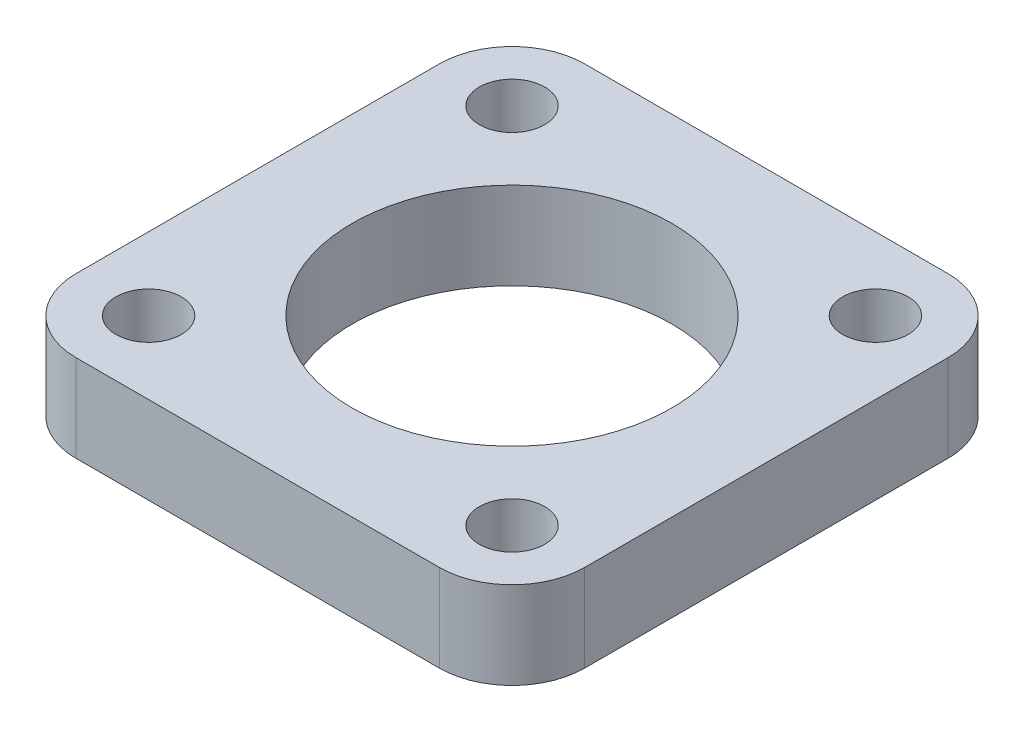
ISO-10303-21;
HEADER;
FILE_DESCRIPTION(('STEP AP214'),'2;1');
FILE_NAME('part.step','',(''),(''),'','','');
FILE_SCHEMA(('AUTOMOTIVE_DESIGN { 1 0 10303 214 1 1 1 1 }'));
ENDSEC;
DATA;
#1=APPLICATION_CONTEXT('core data for automotive mechanical design processes');
#2=APPLICATION_PROTOCOL_DEFINITION('international standard','automotive_design',2000,#1);
#3=PRODUCT_CONTEXT('',#1,'mechanical');
#4=PRODUCT('Part','Part','',(#3));
#5=PRODUCT_RELATED_PRODUCT_CATEGORY('part','',(#4));
#6=PRODUCT_DEFINITION_FORMATION('','',#4);
#7=PRODUCT_DEFINITION_CONTEXT('part definition',#1,'design');
#8=PRODUCT_DEFINITION('design','',#6,#7);
#9=PRODUCT_DEFINITION_SHAPE('','',#8);
#10=(LENGTH_UNIT() NAMED_UNIT(*) SI_UNIT(.MILLI.,.METRE.));
#11=(NAMED_UNIT(*) PLANE_ANGLE_UNIT() SI_UNIT($,.RADIAN.));
#12=(NAMED_UNIT(*) SI_UNIT($,.STERADIAN.) SOLID_ANGLE_UNIT());
#13=UNCERTAINTY_MEASURE_WITH_UNIT(LENGTH_MEASURE(1.E-05),#10,'distance_accuracy_value','');
#14=(GEOMETRIC_REPRESENTATION_CONTEXT(3) GLOBAL_UNCERTAINTY_ASSIGNED_CONTEXT((#13)) GLOBAL_UNIT_ASSIGNED_CONTEXT((#10,
#11,#12)) REPRESENTATION_CONTEXT('',''));
#15=CARTESIAN_POINT('',(0.,0.,0.));
#16=DIRECTION('',(0.,0.,1.));
#17=DIRECTION('',(1.,0.,0.));
#18=AXIS2_PLACEMENT_3D('',#15,#16,#17);
#19=CARTESIAN_POINT('',(0.,3.,0.));
#20=DIRECTION('',(0.,-1.,0.));
#21=DIRECTION('',(0.,0.,-1.));
#22=AXIS2_PLACEMENT_3D('',#19,#20,#21);
#23=PLANE('',#22);
#24=CARTESIAN_POINT('',(12.5000000000044,3.,-12.4999999999972));
#25=DIRECTION('',(0.,1.,0.));
#26=DIRECTION('',(0.,0.,1.));
#27=AXIS2_PLACEMENT_3D('',#24,#25,#26);
#28=CIRCLE('',#27,2.25);
#29=CARTESIAN_POINT('',(12.5000000000044,3.,-10.2499999999972));
#30=VERTEX_POINT('',#29);
#31=EDGE_CURVE('E208',#30,#30,#28,.T.);
#32=ORIENTED_EDGE('',*,*,#31,.F.);
#33=EDGE_LOOP('',(#32));
#34=FACE_BOUND('',#33,.T.);
#35=CARTESIAN_POINT('',(-12.4999999999956,3.,-12.4999999999972));
#36=DIRECTION('',(0.,1.,0.));
#37=DIRECTION('',(0.,0.,1.));
#38=AXIS2_PLACEMENT_3D('',#35,#36,#37);
#39=CIRCLE('',#38,2.25);
#40=CARTESIAN_POINT('',(-12.4999999999956,3.,-10.2499999999972));
#41=VERTEX_POINT('',#40);
#42=EDGE_CURVE('E202',#41,#41,#39,.T.);
#43=ORIENTED_EDGE('',*,*,#42,.F.);
#44=EDGE_LOOP('',(#43));
#45=FACE_BOUND('',#44,.T.);
#46=CARTESIAN_POINT('',(12.5000000000044,3.,12.5000000000028));
#47=DIRECTION('',(0.,1.,0.));
#48=DIRECTION('',(0.,0.,1.));
#49=AXIS2_PLACEMENT_3D('',#46,#47,#48);
#50=CIRCLE('',#49,2.25);
#51=CARTESIAN_POINT('',(12.5000000000044,3.,14.7500000000028));
#52=VERTEX_POINT('',#51);
#53=EDGE_CURVE('E190',#52,#52,#50,.T.);
#54=ORIENTED_EDGE('',*,*,#53,.F.);
#55=EDGE_LOOP('',(#54));
#56=FACE_BOUND('',#55,.T.);
#57=DIRECTION('',(0.,0.,-1.));
#58=VECTOR('',#57,1.);
#59=CARTESIAN_POINT('',(17.5,3.,17.5));
#60=LINE('',#59,#58);
#61=CARTESIAN_POINT('',(17.5,3.,12.5));
#62=VERTEX_POINT('',#61);
#63=CARTESIAN_POINT('',(17.5,3.,-12.5));
#64=VERTEX_POINT('',#63);
#65=EDGE_CURVE('E139',#62,#64,#60,.T.);
#66=ORIENTED_EDGE('',*,*,#65,.T.);
#67=CARTESIAN_POINT('',(12.5,3.,-12.5));
#68=DIRECTION('',(0.,-1.,0.));
#69=DIRECTION('',(0.,0.,-1.));
#70=AXIS2_PLACEMENT_3D('',#67,#68,#69);
#71=CIRCLE('',#70,5.);
#72=CARTESIAN_POINT('',(12.5,3.,-17.5));
#73=VERTEX_POINT('',#72);
#74=EDGE_CURVE('E153',#64,#73,#71,.F.);
#75=ORIENTED_EDGE('',*,*,#74,.T.);
#76=DIRECTION('',(-1.,0.,0.));
#77=VECTOR('',#76,1.);
#78=CARTESIAN_POINT('',(-17.5,3.,-17.5));
#79=LINE('',#78,#77);
#80=CARTESIAN_POINT('',(-12.5,3.,-17.5));
#81=VERTEX_POINT('',#80);
#82=EDGE_CURVE('E120',#73,#81,#79,.T.);
#83=ORIENTED_EDGE('',*,*,#82,.T.);
#84=CARTESIAN_POINT('',(-12.5,3.,-12.5));
#85=DIRECTION('',(0.,-1.,0.));
#86=DIRECTION('',(0.,0.,-1.));
#87=AXIS2_PLACEMENT_3D('',#84,#85,#86);
#88=CIRCLE('',#87,5.);
#89=CARTESIAN_POINT('',(-17.5,3.,-12.5));
#90=VERTEX_POINT('',#89);
#91=EDGE_CURVE('E149',#81,#90,#88,.F.);
#92=ORIENTED_EDGE('',*,*,#91,.T.);
#93=DIRECTION('',(0.,0.,1.));
#94=VECTOR('',#93,1.);
#95=CARTESIAN_POINT('',(-17.5,3.,17.5));
#96=LINE('',#95,#94);
#97=CARTESIAN_POINT('',(-17.5,3.,12.5));
#98=VERTEX_POINT('',#97);
#99=EDGE_CURVE('E162',#90,#98,#96,.T.);
#100=ORIENTED_EDGE('',*,*,#99,.T.);
#101=CARTESIAN_POINT('',(-12.5,3.,12.5));
#102=DIRECTION('',(0.,-1.,0.));
#103=DIRECTION('',(0.,0.,-1.));
#104=AXIS2_PLACEMENT_3D('',#101,#102,#103);
#105=CIRCLE('',#104,5.);
#106=CARTESIAN_POINT('',(-12.5,3.,17.5));
#107=VERTEX_POINT('',#106);
#108=EDGE_CURVE('E55',#98,#107,#105,.F.);
#109=ORIENTED_EDGE('',*,*,#108,.T.);
#110=DIRECTION('',(1.,0.,0.));
#111=VECTOR('',#110,1.);
#112=CARTESIAN_POINT('',(-17.5,3.,17.5));
#113=LINE('',#112,#111);
#114=CARTESIAN_POINT('',(12.5,3.,17.5));
#115=VERTEX_POINT('',#114);
#116=EDGE_CURVE('E140',#107,#115,#113,.T.);
#117=ORIENTED_EDGE('',*,*,#116,.T.);
#118=CARTESIAN_POINT('',(12.5,3.,12.5));
#119=DIRECTION('',(0.,-1.,0.));
#120=DIRECTION('',(0.,0.,-1.));
#121=AXIS2_PLACEMENT_3D('',#118,#119,#120);
#122=CIRCLE('',#121,5.);
#123=EDGE_CURVE('E151',#115,#62,#122,.F.);
#124=ORIENTED_EDGE('',*,*,#123,.T.);
#125=EDGE_LOOP('',(#66,#75,#83,#92,#100,#109,#117,#124));
#126=FACE_BOUND('',#125,.T.);
#127=CARTESIAN_POINT('',(0.,3.,0.));
#128=DIRECTION('',(0.,1.,0.));
#129=DIRECTION('',(0.,0.,1.));
#130=AXIS2_PLACEMENT_3D('',#127,#128,#129);
#131=CIRCLE('',#130,11.);
#132=CARTESIAN_POINT('',(0.,3.,11.));
#133=VERTEX_POINT('',#132);
#134=EDGE_CURVE('E134',#133,#133,#131,.T.);
#135=ORIENTED_EDGE('',*,*,#134,.F.);
#136=EDGE_LOOP('',(#135));
#137=FACE_BOUND('',#136,.T.);
#138=CARTESIAN_POINT('',(-12.4999999999956,3.,12.5000000000029));
#139=DIRECTION('',(0.,1.,0.));
#140=DIRECTION('',(0.,0.,1.));
#141=AXIS2_PLACEMENT_3D('',#138,#139,#140);
#142=CIRCLE('',#141,2.25);
#143=CARTESIAN_POINT('',(-12.4999999999956,3.,14.7500000000029));
#144=VERTEX_POINT('',#143);
#145=EDGE_CURVE('E196',#144,#144,#142,.T.);
#146=ORIENTED_EDGE('',*,*,#145,.F.);
#147=EDGE_LOOP('',(#146));
#148=FACE_BOUND('',#147,.T.);
#149=ADVANCED_FACE('F33',(#34,#45,#56,#126,#137,#148),#23,.F.);
#150=CARTESIAN_POINT('',(0.,-3.,0.));
#151=DIRECTION('',(0.,-1.,0.));
#152=DIRECTION('',(0.,0.,-1.));
#153=AXIS2_PLACEMENT_3D('',#150,#151,#152);
#154=PLANE('',#153);
#155=CARTESIAN_POINT('',(12.5000000000044,-3.,-12.4999999999972));
#156=DIRECTION('',(0.,-1.,0.));
#157=DIRECTION('',(0.,0.,-1.));
#158=AXIS2_PLACEMENT_3D('',#155,#156,#157);
#159=CIRCLE('',#158,2.25);
#160=CARTESIAN_POINT('',(12.5000000000044,-3.,-14.7499999999972));
#161=VERTEX_POINT('',#160);
#162=EDGE_CURVE('E205',#161,#161,#159,.T.);
#163=ORIENTED_EDGE('',*,*,#162,.F.);
#164=EDGE_LOOP('',(#163));
#165=FACE_BOUND('',#164,.T.);
#166=CARTESIAN_POINT('',(-12.4999999999956,-3.,-12.4999999999972));
#167=DIRECTION('',(0.,-1.,0.));
#168=DIRECTION('',(0.,0.,-1.));
#169=AXIS2_PLACEMENT_3D('',#166,#167,#168);
#170=CIRCLE('',#169,2.25);
#171=CARTESIAN_POINT('',(-12.4999999999956,-3.,-14.7499999999972));
#172=VERTEX_POINT('',#171);
#173=EDGE_CURVE('E199',#172,#172,#170,.T.);
#174=ORIENTED_EDGE('',*,*,#173,.F.);
#175=EDGE_LOOP('',(#174));
#176=FACE_BOUND('',#175,.T.);
#177=CARTESIAN_POINT('',(-12.4999999999956,-3.,12.5000000000029));
#178=DIRECTION('',(0.,-1.,0.));
#179=DIRECTION('',(0.,0.,-1.));
#180=AXIS2_PLACEMENT_3D('',#177,#178,#179);
#181=CIRCLE('',#180,2.25);
#182=CARTESIAN_POINT('',(-12.4999999999956,-3.,10.2500000000029));
#183=VERTEX_POINT('',#182);
#184=EDGE_CURVE('E193',#183,#183,#181,.T.);
#185=ORIENTED_EDGE('',*,*,#184,.F.);
#186=EDGE_LOOP('',(#185));
#187=FACE_BOUND('',#186,.T.);
#188=CARTESIAN_POINT('',(12.5000000000044,-3.,12.5000000000028));
#189=DIRECTION('',(0.,-1.,0.));
#190=DIRECTION('',(0.,0.,-1.));
#191=AXIS2_PLACEMENT_3D('',#188,#189,#190);
#192=CIRCLE('',#191,2.25);
#193=CARTESIAN_POINT('',(12.5000000000044,-3.,10.2500000000028));
#194=VERTEX_POINT('',#193);
#195=EDGE_CURVE('E185',#194,#194,#192,.T.);
#196=ORIENTED_EDGE('',*,*,#195,.F.);
#197=EDGE_LOOP('',(#196));
#198=FACE_BOUND('',#197,.T.);
#199=DIRECTION('',(-1.,0.,0.));
#200=VECTOR('',#199,1.);
#201=CARTESIAN_POINT('',(-17.5,-3.,-17.5));
#202=LINE('',#201,#200);
#203=CARTESIAN_POINT('',(12.5,-3.,-17.5));
#204=VERTEX_POINT('',#203);
#205=CARTESIAN_POINT('',(-12.5,-3.,-17.5));
#206=VERTEX_POINT('',#205);
#207=EDGE_CURVE('E117',#204,#206,#202,.T.);
#208=ORIENTED_EDGE('',*,*,#207,.F.);
#209=CARTESIAN_POINT('',(12.5,-3.,-12.5));
#210=DIRECTION('',(0.,-1.,0.));
#211=DIRECTION('',(0.,0.,-1.));
#212=AXIS2_PLACEMENT_3D('',#209,#210,#211);
#213=CIRCLE('',#212,5.);
#214=CARTESIAN_POINT('',(17.5,-3.,-12.5));
#215=VERTEX_POINT('',#214);
#216=EDGE_CURVE('E100',#204,#215,#213,.T.);
#217=ORIENTED_EDGE('',*,*,#216,.T.);
#218=DIRECTION('',(0.,0.,-1.));
#219=VECTOR('',#218,1.);
#220=CARTESIAN_POINT('',(17.5,-3.,17.5));
#221=LINE('',#220,#219);
#222=CARTESIAN_POINT('',(17.5,-3.,12.5));
#223=VERTEX_POINT('',#222);
#224=EDGE_CURVE('E129',#223,#215,#221,.T.);
#225=ORIENTED_EDGE('',*,*,#224,.F.);
#226=CARTESIAN_POINT('',(12.5,-3.,12.5));
#227=DIRECTION('',(0.,-1.,0.));
#228=DIRECTION('',(0.,0.,-1.));
#229=AXIS2_PLACEMENT_3D('',#226,#227,#228);
#230=CIRCLE('',#229,5.);
#231=CARTESIAN_POINT('',(12.5,-3.,17.5));
#232=VERTEX_POINT('',#231);
#233=EDGE_CURVE('E111',#223,#232,#230,.T.);
#234=ORIENTED_EDGE('',*,*,#233,.T.);
#235=DIRECTION('',(1.,0.,0.));
#236=VECTOR('',#235,1.);
#237=CARTESIAN_POINT('',(-17.5,-3.,17.5));
#238=LINE('',#237,#236);
#239=CARTESIAN_POINT('',(-12.5,-3.,17.5));
#240=VERTEX_POINT('',#239);
#241=EDGE_CURVE('E132',#240,#232,#238,.T.);
#242=ORIENTED_EDGE('',*,*,#241,.F.);
#243=CARTESIAN_POINT('',(-12.5,-3.,12.5));
#244=DIRECTION('',(0.,-1.,0.));
#245=DIRECTION('',(0.,0.,-1.));
#246=AXIS2_PLACEMENT_3D('',#243,#244,#245);
#247=CIRCLE('',#246,5.);
#248=CARTESIAN_POINT('',(-17.5,-3.,12.5));
#249=VERTEX_POINT('',#248);
#250=EDGE_CURVE('E121',#240,#249,#247,.T.);
#251=ORIENTED_EDGE('',*,*,#250,.T.);
#252=DIRECTION('',(0.,0.,1.));
#253=VECTOR('',#252,1.);
#254=CARTESIAN_POINT('',(-17.5,-3.,17.5));
#255=LINE('',#254,#253);
#256=CARTESIAN_POINT('',(-17.5,-3.,-12.5));
#257=VERTEX_POINT('',#256);
#258=EDGE_CURVE('E128',#257,#249,#255,.T.);
#259=ORIENTED_EDGE('',*,*,#258,.F.);
#260=CARTESIAN_POINT('',(-12.5,-3.,-12.5));
#261=DIRECTION('',(0.,-1.,0.));
#262=DIRECTION('',(0.,0.,-1.));
#263=AXIS2_PLACEMENT_3D('',#260,#261,#262);
#264=CIRCLE('',#263,5.);
#265=EDGE_CURVE('E127',#257,#206,#264,.T.);
#266=ORIENTED_EDGE('',*,*,#265,.T.);
#267=EDGE_LOOP('',(#208,#217,#225,#234,#242,#251,#259,#266));
#268=FACE_BOUND('',#267,.T.);
#269=CARTESIAN_POINT('',(0.,-3.,0.));
#270=DIRECTION('',(0.,1.,0.));
#271=DIRECTION('',(0.,0.,1.));
#272=AXIS2_PLACEMENT_3D('',#269,#270,#271);
#273=CIRCLE('',#272,11.);
#274=CARTESIAN_POINT('',(0.,-3.,11.));
#275=VERTEX_POINT('',#274);
#276=EDGE_CURVE('E182',#275,#275,#273,.T.);
#277=ORIENTED_EDGE('',*,*,#276,.T.);
#278=EDGE_LOOP('',(#277));
#279=FACE_BOUND('',#278,.T.);
#280=ADVANCED_FACE('F124',(#165,#176,#187,#198,#268,#279),#154,.T.);
#281=CARTESIAN_POINT('',(17.5,3.,17.5));
#282=DIRECTION('',(-1.,0.,0.));
#283=DIRECTION('',(0.,0.,1.));
#284=AXIS2_PLACEMENT_3D('',#281,#282,#283);
#285=PLANE('',#284);
#286=ORIENTED_EDGE('',*,*,#224,.T.);
#287=DIRECTION('',(0.,-1.,0.));
#288=VECTOR('',#287,1.);
#289=CARTESIAN_POINT('',(17.5,3.,-12.5));
#290=LINE('',#289,#288);
#291=EDGE_CURVE('E105',#215,#64,#290,.F.);
#292=ORIENTED_EDGE('',*,*,#291,.T.);
#293=ORIENTED_EDGE('',*,*,#65,.F.);
#294=DIRECTION('',(0.,-1.,0.));
#295=VECTOR('',#294,1.);
#296=CARTESIAN_POINT('',(17.5,3.,12.5));
#297=LINE('',#296,#295);
#298=EDGE_CURVE('E110',#62,#223,#297,.T.);
#299=ORIENTED_EDGE('',*,*,#298,.T.);
#300=EDGE_LOOP('',(#286,#292,#293,#299));
#301=FACE_BOUND('',#300,.T.);
#302=ADVANCED_FACE('F178',(#301),#285,.F.);
#303=CARTESIAN_POINT('',(-17.5,3.,-17.5));
#304=DIRECTION('',(0.,0.,1.));
#305=DIRECTION('',(1.,0.,0.));
#306=AXIS2_PLACEMENT_3D('',#303,#304,#305);
#307=PLANE('',#306);
#308=ORIENTED_EDGE('',*,*,#82,.F.);
#309=DIRECTION('',(0.,-1.,0.));
#310=VECTOR('',#309,1.);
#311=CARTESIAN_POINT('',(12.5,3.,-17.5));
#312=LINE('',#311,#310);
#313=EDGE_CURVE('E104',#73,#204,#312,.T.);
#314=ORIENTED_EDGE('',*,*,#313,.T.);
#315=ORIENTED_EDGE('',*,*,#207,.T.);
#316=DIRECTION('',(0.,-1.,0.));
#317=VECTOR('',#316,1.);
#318=CARTESIAN_POINT('',(-12.5,3.,-17.5));
#319=LINE('',#318,#317);
#320=EDGE_CURVE('E122',#206,#81,#319,.F.);
#321=ORIENTED_EDGE('',*,*,#320,.T.);
#322=EDGE_LOOP('',(#308,#314,#315,#321));
#323=FACE_BOUND('',#322,.T.);
#324=ADVANCED_FACE('F116',(#323),#307,.F.);
#325=CARTESIAN_POINT('',(-17.5,3.,17.5));
#326=DIRECTION('',(1.,0.,0.));
#327=DIRECTION('',(0.,0.,-1.));
#328=AXIS2_PLACEMENT_3D('',#325,#326,#327);
#329=PLANE('',#328);
#330=ORIENTED_EDGE('',*,*,#99,.F.);
#331=DIRECTION('',(0.,-1.,0.));
#332=VECTOR('',#331,1.);
#333=CARTESIAN_POINT('',(-17.5,3.,-12.5));
#334=LINE('',#333,#332);
#335=EDGE_CURVE('E11',#90,#257,#334,.T.);
#336=ORIENTED_EDGE('',*,*,#335,.T.);
#337=ORIENTED_EDGE('',*,*,#258,.T.);
#338=DIRECTION('',(0.,-1.,0.));
#339=VECTOR('',#338,1.);
#340=CARTESIAN_POINT('',(-17.5,3.,12.5));
#341=LINE('',#340,#339);
#342=EDGE_CURVE('E41',#249,#98,#341,.F.);
#343=ORIENTED_EDGE('',*,*,#342,.T.);
#344=EDGE_LOOP('',(#330,#336,#337,#343));
#345=FACE_BOUND('',#344,.T.);
#346=ADVANCED_FACE('F161',(#345),#329,.F.);
#347=CARTESIAN_POINT('',(-17.5,3.,17.5));
#348=DIRECTION('',(0.,0.,-1.));
#349=DIRECTION('',(-1.,0.,0.));
#350=AXIS2_PLACEMENT_3D('',#347,#348,#349);
#351=PLANE('',#350);
#352=ORIENTED_EDGE('',*,*,#241,.T.);
#353=DIRECTION('',(0.,-1.,0.));
#354=VECTOR('',#353,1.);
#355=CARTESIAN_POINT('',(12.5,3.,17.5));
#356=LINE('',#355,#354);
#357=EDGE_CURVE('E48',#232,#115,#356,.F.);
#358=ORIENTED_EDGE('',*,*,#357,.T.);
#359=ORIENTED_EDGE('',*,*,#116,.F.);
#360=DIRECTION('',(0.,-1.,0.));
#361=VECTOR('',#360,1.);
#362=CARTESIAN_POINT('',(-12.5,3.,17.5));
#363=LINE('',#362,#361);
#364=EDGE_CURVE('E155',#107,#240,#363,.T.);
#365=ORIENTED_EDGE('',*,*,#364,.T.);
#366=EDGE_LOOP('',(#352,#358,#359,#365));
#367=FACE_BOUND('',#366,.T.);
#368=ADVANCED_FACE('F171',(#367),#351,.F.);
#369=CARTESIAN_POINT('',(0.,3.,0.));
#370=DIRECTION('',(0.,-1.,0.));
#371=DIRECTION('',(0.,0.,-1.));
#372=AXIS2_PLACEMENT_3D('',#369,#370,#371);
#373=CYLINDRICAL_SURFACE('',#372,11.);
#374=ORIENTED_EDGE('',*,*,#134,.T.);
#375=EDGE_LOOP('',(#374));
#376=FACE_BOUND('',#375,.T.);
#377=ORIENTED_EDGE('',*,*,#276,.F.);
#378=EDGE_LOOP('',(#377));
#379=FACE_BOUND('',#378,.T.);
#380=ADVANCED_FACE('F226',(#376,#379),#373,.F.);
#381=CARTESIAN_POINT('',(12.5000000000044,3.,12.5000000000028));
#382=DIRECTION('',(0.,1.,0.));
#383=DIRECTION('',(0.,0.,1.));
#384=AXIS2_PLACEMENT_3D('',#381,#382,#383);
#385=CYLINDRICAL_SURFACE('',#384,2.25);
#386=ORIENTED_EDGE('',*,*,#53,.T.);
#387=EDGE_LOOP('',(#386));
#388=FACE_BOUND('',#387,.T.);
#389=ORIENTED_EDGE('',*,*,#195,.T.);
#390=EDGE_LOOP('',(#389));
#391=FACE_BOUND('',#390,.T.);
#392=ADVANCED_FACE('F222',(#388,#391),#385,.F.);
#393=CARTESIAN_POINT('',(-12.4999999999956,3.,12.5000000000029));
#394=DIRECTION('',(0.,1.,0.));
#395=DIRECTION('',(0.,0.,1.));
#396=AXIS2_PLACEMENT_3D('',#393,#394,#395);
#397=CYLINDRICAL_SURFACE('',#396,2.25);
#398=ORIENTED_EDGE('',*,*,#145,.T.);
#399=EDGE_LOOP('',(#398));
#400=FACE_BOUND('',#399,.T.);
#401=ORIENTED_EDGE('',*,*,#184,.T.);
#402=EDGE_LOOP('',(#401));
#403=FACE_BOUND('',#402,.T.);
#404=ADVANCED_FACE('F225',(#400,#403),#397,.F.);
#405=CARTESIAN_POINT('',(-12.4999999999956,3.,-12.4999999999972));
#406=DIRECTION('',(0.,1.,0.));
#407=DIRECTION('',(0.,0.,1.));
#408=AXIS2_PLACEMENT_3D('',#405,#406,#407);
#409=CYLINDRICAL_SURFACE('',#408,2.25);
#410=ORIENTED_EDGE('',*,*,#42,.T.);
#411=EDGE_LOOP('',(#410));
#412=FACE_BOUND('',#411,.T.);
#413=ORIENTED_EDGE('',*,*,#173,.T.);
#414=EDGE_LOOP('',(#413));
#415=FACE_BOUND('',#414,.T.);
#416=ADVANCED_FACE('F320',(#412,#415),#409,.F.);
#417=CARTESIAN_POINT('',(12.5000000000044,3.,-12.4999999999972));
#418=DIRECTION('',(0.,1.,0.));
#419=DIRECTION('',(0.,0.,1.));
#420=AXIS2_PLACEMENT_3D('',#417,#418,#419);
#421=CYLINDRICAL_SURFACE('',#420,2.25);
#422=ORIENTED_EDGE('',*,*,#31,.T.);
#423=EDGE_LOOP('',(#422));
#424=FACE_BOUND('',#423,.T.);
#425=ORIENTED_EDGE('',*,*,#162,.T.);
#426=EDGE_LOOP('',(#425));
#427=FACE_BOUND('',#426,.T.);
#428=ADVANCED_FACE('F212',(#424,#427),#421,.F.);
#429=CARTESIAN_POINT('',(12.5,3.,-12.5));
#430=DIRECTION('',(0.,-1.,0.));
#431=DIRECTION('',(0.,0.,-1.));
#432=AXIS2_PLACEMENT_3D('',#429,#430,#431);
#433=CYLINDRICAL_SURFACE('',#432,5.);
#434=ORIENTED_EDGE('',*,*,#74,.F.);
#435=ORIENTED_EDGE('',*,*,#291,.F.);
#436=ORIENTED_EDGE('',*,*,#216,.F.);
#437=ORIENTED_EDGE('',*,*,#313,.F.);
#438=EDGE_LOOP('',(#434,#435,#436,#437));
#439=FACE_BOUND('',#438,.T.);
#440=ADVANCED_FACE('F103',(#439),#433,.T.);
#441=CARTESIAN_POINT('',(12.5,3.,12.5));
#442=DIRECTION('',(0.,-1.,0.));
#443=DIRECTION('',(0.,0.,-1.));
#444=AXIS2_PLACEMENT_3D('',#441,#442,#443);
#445=CYLINDRICAL_SURFACE('',#444,5.);
#446=ORIENTED_EDGE('',*,*,#123,.F.);
#447=ORIENTED_EDGE('',*,*,#357,.F.);
#448=ORIENTED_EDGE('',*,*,#233,.F.);
#449=ORIENTED_EDGE('',*,*,#298,.F.);
#450=EDGE_LOOP('',(#446,#447,#448,#449));
#451=FACE_BOUND('',#450,.T.);
#452=ADVANCED_FACE('F175',(#451),#445,.T.);
#453=CARTESIAN_POINT('',(-12.5,3.,-12.5));
#454=DIRECTION('',(0.,-1.,0.));
#455=DIRECTION('',(0.,0.,-1.));
#456=AXIS2_PLACEMENT_3D('',#453,#454,#455);
#457=CYLINDRICAL_SURFACE('',#456,5.);
#458=ORIENTED_EDGE('',*,*,#91,.F.);
#459=ORIENTED_EDGE('',*,*,#320,.F.);
#460=ORIENTED_EDGE('',*,*,#265,.F.);
#461=ORIENTED_EDGE('',*,*,#335,.F.);
#462=EDGE_LOOP('',(#458,#459,#460,#461));
#463=FACE_BOUND('',#462,.T.);
#464=ADVANCED_FACE('F250',(#463),#457,.T.);
#465=CARTESIAN_POINT('',(-12.5,3.,12.5));
#466=DIRECTION('',(0.,-1.,0.));
#467=DIRECTION('',(0.,0.,-1.));
#468=AXIS2_PLACEMENT_3D('',#465,#466,#467);
#469=CYLINDRICAL_SURFACE('',#468,5.);
#470=ORIENTED_EDGE('',*,*,#108,.F.);
#471=ORIENTED_EDGE('',*,*,#342,.F.);
#472=ORIENTED_EDGE('',*,*,#250,.F.);
#473=ORIENTED_EDGE('',*,*,#364,.F.);
#474=EDGE_LOOP('',(#470,#471,#472,#473));
#475=FACE_BOUND('',#474,.T.);
#476=ADVANCED_FACE('F35',(#475),#469,.T.);
#477=CLOSED_SHELL('',(#149,#280,#302,#324,#346,#368,#380,#392,#404,#416,#428,#440,#452,#464,#476));
#478=MANIFOLD_SOLID_BREP('B2',#477);
#479=ADVANCED_BREP_SHAPE_REPRESENTATION('',(#18,#478),#14);
#480=SHAPE_DEFINITION_REPRESENTATION(#9,#479);
ENDSEC;
END-ISO-10303-21;
